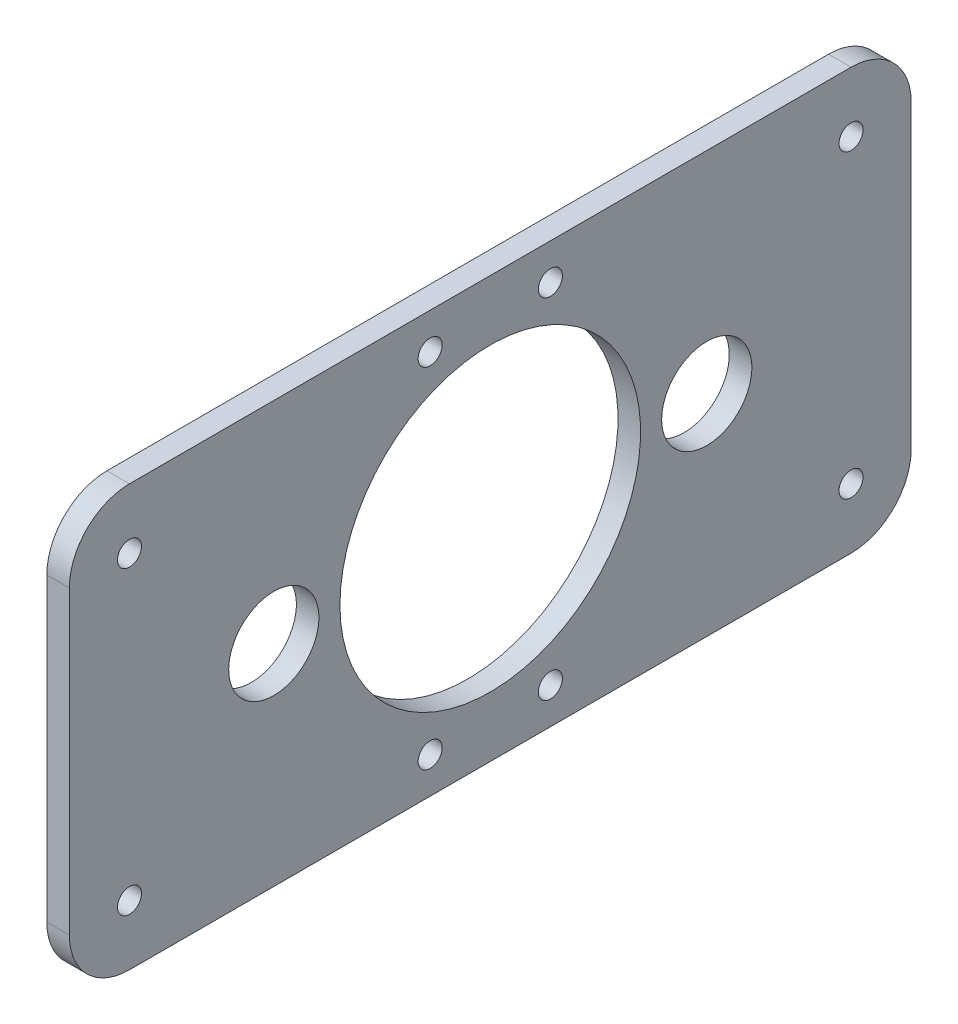
ISO-10303-21;
HEADER;
FILE_DESCRIPTION(('STEP AP214'),'2;1');
FILE_NAME('part.step','',(''),(''),'','','');
FILE_SCHEMA(('AUTOMOTIVE_DESIGN { 1 0 10303 214 1 1 1 1 }'));
ENDSEC;
DATA;
#1=APPLICATION_CONTEXT('core data for automotive mechanical design processes');
#2=APPLICATION_PROTOCOL_DEFINITION('international standard','automotive_design',2000,#1);
#3=PRODUCT_CONTEXT('',#1,'mechanical');
#4=PRODUCT('Part','Part','',(#3));
#5=PRODUCT_RELATED_PRODUCT_CATEGORY('part','',(#4));
#6=PRODUCT_DEFINITION_FORMATION('','',#4);
#7=PRODUCT_DEFINITION_CONTEXT('part definition',#1,'design');
#8=PRODUCT_DEFINITION('design','',#6,#7);
#9=PRODUCT_DEFINITION_SHAPE('','',#8);
#10=(LENGTH_UNIT() NAMED_UNIT(*) SI_UNIT(.MILLI.,.METRE.));
#11=(NAMED_UNIT(*) PLANE_ANGLE_UNIT() SI_UNIT($,.RADIAN.));
#12=(NAMED_UNIT(*) SI_UNIT($,.STERADIAN.) SOLID_ANGLE_UNIT());
#13=UNCERTAINTY_MEASURE_WITH_UNIT(LENGTH_MEASURE(1.E-05),#10,'distance_accuracy_value','');
#14=(GEOMETRIC_REPRESENTATION_CONTEXT(3) GLOBAL_UNCERTAINTY_ASSIGNED_CONTEXT((#13)) GLOBAL_UNIT_ASSIGNED_CONTEXT((#10,
#11,#12)) REPRESENTATION_CONTEXT('',''));
#15=CARTESIAN_POINT('',(0.,0.,0.));
#16=DIRECTION('',(0.,0.,1.));
#17=DIRECTION('',(1.,0.,0.));
#18=AXIS2_PLACEMENT_3D('',#15,#16,#17);
#19=CARTESIAN_POINT('',(4.7625,43.2742885665238,239.434866781271));
#20=DIRECTION('',(1.,0.,0.));
#21=DIRECTION('',(0.,0.,1.));
#22=AXIS2_PLACEMENT_3D('',#19,#20,#21);
#23=CYLINDRICAL_SURFACE('',#22,12.7);
#24=DIRECTION('',(1.,0.,0.));
#25=VECTOR('',#24,1.);
#26=CARTESIAN_POINT('',(4.7625,43.2742885665239,226.734866781271));
#27=LINE('',#26,#25);
#28=CARTESIAN_POINT('',(0.,43.2742885665239,226.734866781271));
#29=VERTEX_POINT('',#28);
#30=CARTESIAN_POINT('',(4.7625,43.2742885665239,226.734866781271));
#31=VERTEX_POINT('',#30);
#32=EDGE_CURVE('E11',#29,#31,#27,.T.);
#33=ORIENTED_EDGE('',*,*,#32,.T.);
#34=CARTESIAN_POINT('',(4.7625,43.2742885665238,239.434866781271));
#35=DIRECTION('',(-1.,0.,0.));
#36=DIRECTION('',(0.,0.,1.));
#37=AXIS2_PLACEMENT_3D('',#34,#35,#36);
#38=CIRCLE('',#37,12.7);
#39=CARTESIAN_POINT('',(4.7625,30.5742885665238,239.434866781271));
#40=VERTEX_POINT('',#39);
#41=EDGE_CURVE('E192',#31,#40,#38,.T.);
#42=ORIENTED_EDGE('',*,*,#41,.T.);
#43=DIRECTION('',(1.,0.,0.));
#44=VECTOR('',#43,1.);
#45=CARTESIAN_POINT('',(4.7625,30.5742885665238,239.434866781271));
#46=LINE('',#45,#44);
#47=CARTESIAN_POINT('',(0.,30.5742885665238,239.434866781271));
#48=VERTEX_POINT('',#47);
#49=EDGE_CURVE('E47',#48,#40,#46,.T.);
#50=ORIENTED_EDGE('',*,*,#49,.F.);
#51=CARTESIAN_POINT('',(0.,43.2742885665238,239.434866781271));
#52=DIRECTION('',(-1.,0.,0.));
#53=DIRECTION('',(0.,0.,1.));
#54=AXIS2_PLACEMENT_3D('',#51,#52,#53);
#55=CIRCLE('',#54,12.7);
#56=EDGE_CURVE('E93',#29,#48,#55,.T.);
#57=ORIENTED_EDGE('',*,*,#56,.F.);
#58=EDGE_LOOP('',(#33,#42,#50,#57));
#59=FACE_BOUND('',#58,.T.);
#60=ADVANCED_FACE('F37',(#59),#23,.T.);
#61=CARTESIAN_POINT('',(4.7625,30.5742885665238,391.834866781271));
#62=DIRECTION('',(0.,-1.,0.));
#63=DIRECTION('',(0.,0.,1.));
#64=AXIS2_PLACEMENT_3D('',#61,#62,#63);
#65=PLANE('',#64);
#66=ORIENTED_EDGE('',*,*,#49,.T.);
#67=DIRECTION('',(0.,0.,1.));
#68=VECTOR('',#67,1.);
#69=CARTESIAN_POINT('',(4.7625,30.5742885665238,391.834866781271));
#70=LINE('',#69,#68);
#71=CARTESIAN_POINT('',(4.7625,30.5742885665238,391.834866781271));
#72=VERTEX_POINT('',#71);
#73=EDGE_CURVE('E187',#40,#72,#70,.T.);
#74=ORIENTED_EDGE('',*,*,#73,.T.);
#75=DIRECTION('',(1.,0.,0.));
#76=VECTOR('',#75,1.);
#77=CARTESIAN_POINT('',(4.7625,30.5742885665238,391.834866781271));
#78=LINE('',#77,#76);
#79=CARTESIAN_POINT('',(0.,30.5742885665238,391.834866781271));
#80=VERTEX_POINT('',#79);
#81=EDGE_CURVE('E174',#80,#72,#78,.T.);
#82=ORIENTED_EDGE('',*,*,#81,.F.);
#83=DIRECTION('',(0.,0.,1.));
#84=VECTOR('',#83,1.);
#85=CARTESIAN_POINT('',(0.,30.5742885665238,239.434866781271));
#86=LINE('',#85,#84);
#87=EDGE_CURVE('E144',#48,#80,#86,.T.);
#88=ORIENTED_EDGE('',*,*,#87,.F.);
#89=EDGE_LOOP('',(#66,#74,#82,#88));
#90=FACE_BOUND('',#89,.T.);
#91=ADVANCED_FACE('F183',(#90),#65,.T.);
#92=CARTESIAN_POINT('',(4.7625,43.2742885665238,391.834866781271));
#93=DIRECTION('',(1.,0.,0.));
#94=DIRECTION('',(0.,0.,1.));
#95=AXIS2_PLACEMENT_3D('',#92,#93,#94);
#96=CYLINDRICAL_SURFACE('',#95,12.7);
#97=ORIENTED_EDGE('',*,*,#81,.T.);
#98=CARTESIAN_POINT('',(4.7625,43.2742885665238,391.834866781271));
#99=DIRECTION('',(-1.,0.,0.));
#100=DIRECTION('',(0.,0.,1.));
#101=AXIS2_PLACEMENT_3D('',#98,#99,#100);
#102=CIRCLE('',#101,12.7);
#103=CARTESIAN_POINT('',(4.7625,43.2742885665239,404.534866781271));
#104=VERTEX_POINT('',#103);
#105=EDGE_CURVE('E195',#72,#104,#102,.T.);
#106=ORIENTED_EDGE('',*,*,#105,.T.);
#107=DIRECTION('',(1.,0.,0.));
#108=VECTOR('',#107,1.);
#109=CARTESIAN_POINT('',(4.7625,43.2742885665239,404.534866781271));
#110=LINE('',#109,#108);
#111=CARTESIAN_POINT('',(0.,43.2742885665239,404.534866781271));
#112=VERTEX_POINT('',#111);
#113=EDGE_CURVE('E171',#112,#104,#110,.T.);
#114=ORIENTED_EDGE('',*,*,#113,.F.);
#115=CARTESIAN_POINT('',(0.,43.2742885665238,391.834866781271));
#116=DIRECTION('',(-1.,0.,0.));
#117=DIRECTION('',(0.,0.,1.));
#118=AXIS2_PLACEMENT_3D('',#115,#116,#117);
#119=CIRCLE('',#118,12.7);
#120=EDGE_CURVE('E141',#80,#112,#119,.T.);
#121=ORIENTED_EDGE('',*,*,#120,.F.);
#122=EDGE_LOOP('',(#97,#106,#114,#121));
#123=FACE_BOUND('',#122,.T.);
#124=ADVANCED_FACE('F255',(#123),#96,.T.);
#125=CARTESIAN_POINT('',(4.7625,43.2742885665239,404.534866781271));
#126=DIRECTION('',(0.,0.,1.));
#127=DIRECTION('',(0.,1.,0.));
#128=AXIS2_PLACEMENT_3D('',#125,#126,#127);
#129=PLANE('',#128);
#130=ORIENTED_EDGE('',*,*,#113,.T.);
#131=DIRECTION('',(0.,1.,0.));
#132=VECTOR('',#131,1.);
#133=CARTESIAN_POINT('',(4.7625,43.2742885665239,404.534866781271));
#134=LINE('',#133,#132);
#135=CARTESIAN_POINT('',(4.7625,106.774288566524,404.534866781271));
#136=VERTEX_POINT('',#135);
#137=EDGE_CURVE('E202',#104,#136,#134,.T.);
#138=ORIENTED_EDGE('',*,*,#137,.T.);
#139=DIRECTION('',(1.,0.,0.));
#140=VECTOR('',#139,1.);
#141=CARTESIAN_POINT('',(4.7625,106.774288566524,404.534866781271));
#142=LINE('',#141,#140);
#143=CARTESIAN_POINT('',(0.,106.774288566524,404.534866781271));
#144=VERTEX_POINT('',#143);
#145=EDGE_CURVE('E168',#144,#136,#142,.T.);
#146=ORIENTED_EDGE('',*,*,#145,.F.);
#147=DIRECTION('',(0.,1.,0.));
#148=VECTOR('',#147,1.);
#149=CARTESIAN_POINT('',(0.,106.774288566524,404.534866781271));
#150=LINE('',#149,#148);
#151=EDGE_CURVE('E138',#112,#144,#150,.T.);
#152=ORIENTED_EDGE('',*,*,#151,.F.);
#153=EDGE_LOOP('',(#130,#138,#146,#152));
#154=FACE_BOUND('',#153,.T.);
#155=ADVANCED_FACE('F349',(#154),#129,.T.);
#156=CARTESIAN_POINT('',(4.7625,106.774288566524,391.834866781271));
#157=DIRECTION('',(1.,0.,0.));
#158=DIRECTION('',(0.,0.,1.));
#159=AXIS2_PLACEMENT_3D('',#156,#157,#158);
#160=CYLINDRICAL_SURFACE('',#159,12.7);
#161=ORIENTED_EDGE('',*,*,#145,.T.);
#162=CARTESIAN_POINT('',(4.7625,106.774288566524,391.834866781271));
#163=DIRECTION('',(-1.,0.,0.));
#164=DIRECTION('',(0.,0.,1.));
#165=AXIS2_PLACEMENT_3D('',#162,#163,#164);
#166=CIRCLE('',#165,12.7);
#167=CARTESIAN_POINT('',(4.7625,119.474288566524,391.834866781271));
#168=VERTEX_POINT('',#167);
#169=EDGE_CURVE('E205',#136,#168,#166,.T.);
#170=ORIENTED_EDGE('',*,*,#169,.T.);
#171=DIRECTION('',(1.,0.,0.));
#172=VECTOR('',#171,1.);
#173=CARTESIAN_POINT('',(4.7625,119.474288566524,391.834866781271));
#174=LINE('',#173,#172);
#175=CARTESIAN_POINT('',(0.,119.474288566524,391.834866781271));
#176=VERTEX_POINT('',#175);
#177=EDGE_CURVE('E108',#176,#168,#174,.T.);
#178=ORIENTED_EDGE('',*,*,#177,.F.);
#179=CARTESIAN_POINT('',(0.,106.774288566524,391.834866781271));
#180=DIRECTION('',(-1.,0.,0.));
#181=DIRECTION('',(0.,0.,1.));
#182=AXIS2_PLACEMENT_3D('',#179,#180,#181);
#183=CIRCLE('',#182,12.7);
#184=EDGE_CURVE('E136',#144,#176,#183,.T.);
#185=ORIENTED_EDGE('',*,*,#184,.F.);
#186=EDGE_LOOP('',(#161,#170,#178,#185));
#187=FACE_BOUND('',#186,.T.);
#188=ADVANCED_FACE('F361',(#187),#160,.T.);
#189=CARTESIAN_POINT('',(4.7625,119.474288566524,391.834866781271));
#190=DIRECTION('',(0.,1.,0.));
#191=DIRECTION('',(0.,0.,-1.));
#192=AXIS2_PLACEMENT_3D('',#189,#190,#191);
#193=PLANE('',#192);
#194=ORIENTED_EDGE('',*,*,#177,.T.);
#195=DIRECTION('',(0.,0.,-1.));
#196=VECTOR('',#195,1.);
#197=CARTESIAN_POINT('',(4.7625,119.474288566524,391.834866781271));
#198=LINE('',#197,#196);
#199=CARTESIAN_POINT('',(4.7625,119.474288566524,239.434866781271));
#200=VERTEX_POINT('',#199);
#201=EDGE_CURVE('E208',#168,#200,#198,.T.);
#202=ORIENTED_EDGE('',*,*,#201,.T.);
#203=DIRECTION('',(1.,0.,0.));
#204=VECTOR('',#203,1.);
#205=CARTESIAN_POINT('',(4.7625,119.474288566524,239.434866781271));
#206=LINE('',#205,#204);
#207=CARTESIAN_POINT('',(0.,119.474288566524,239.434866781271));
#208=VERTEX_POINT('',#207);
#209=EDGE_CURVE('E106',#208,#200,#206,.T.);
#210=ORIENTED_EDGE('',*,*,#209,.F.);
#211=DIRECTION('',(0.,0.,1.));
#212=VECTOR('',#211,1.);
#213=CARTESIAN_POINT('',(0.,119.474288566524,239.434866781271));
#214=LINE('',#213,#212);
#215=EDGE_CURVE('E100',#176,#208,#214,.F.);
#216=ORIENTED_EDGE('',*,*,#215,.F.);
#217=EDGE_LOOP('',(#194,#202,#210,#216));
#218=FACE_BOUND('',#217,.T.);
#219=ADVANCED_FACE('F374',(#218),#193,.T.);
#220=CARTESIAN_POINT('',(4.7625,106.774288566524,239.434866781271));
#221=DIRECTION('',(1.,0.,0.));
#222=DIRECTION('',(0.,0.,1.));
#223=AXIS2_PLACEMENT_3D('',#220,#221,#222);
#224=CYLINDRICAL_SURFACE('',#223,12.7);
#225=ORIENTED_EDGE('',*,*,#209,.T.);
#226=CARTESIAN_POINT('',(4.7625,106.774288566524,239.434866781271));
#227=DIRECTION('',(-1.,0.,0.));
#228=DIRECTION('',(0.,0.,1.));
#229=AXIS2_PLACEMENT_3D('',#226,#227,#228);
#230=CIRCLE('',#229,12.7);
#231=CARTESIAN_POINT('',(4.7625,106.774288566524,226.734866781271));
#232=VERTEX_POINT('',#231);
#233=EDGE_CURVE('E55',#200,#232,#230,.T.);
#234=ORIENTED_EDGE('',*,*,#233,.T.);
#235=DIRECTION('',(1.,0.,0.));
#236=VECTOR('',#235,1.);
#237=CARTESIAN_POINT('',(4.7625,106.774288566524,226.734866781271));
#238=LINE('',#237,#236);
#239=CARTESIAN_POINT('',(0.,106.774288566524,226.734866781271));
#240=VERTEX_POINT('',#239);
#241=EDGE_CURVE('E41',#240,#232,#238,.T.);
#242=ORIENTED_EDGE('',*,*,#241,.F.);
#243=CARTESIAN_POINT('',(0.,106.774288566524,239.434866781271));
#244=DIRECTION('',(-1.,0.,0.));
#245=DIRECTION('',(0.,0.,1.));
#246=AXIS2_PLACEMENT_3D('',#243,#244,#245);
#247=CIRCLE('',#246,12.7);
#248=EDGE_CURVE('E94',#208,#240,#247,.T.);
#249=ORIENTED_EDGE('',*,*,#248,.F.);
#250=EDGE_LOOP('',(#225,#234,#242,#249));
#251=FACE_BOUND('',#250,.T.);
#252=ADVANCED_FACE('F105',(#251),#224,.T.);
#253=CARTESIAN_POINT('',(4.7625,75.0242885665238,269.914866781271));
#254=DIRECTION('',(1.,0.,0.));
#255=DIRECTION('',(0.,0.,1.));
#256=AXIS2_PLACEMENT_3D('',#253,#254,#255);
#257=CYLINDRICAL_SURFACE('',#256,9.52500000000002);
#258=CARTESIAN_POINT('',(4.7625,75.0242885665238,269.914866781271));
#259=DIRECTION('',(-1.,0.,0.));
#260=DIRECTION('',(0.,0.,1.));
#261=AXIS2_PLACEMENT_3D('',#258,#259,#260);
#262=CIRCLE('',#261,9.52500000000002);
#263=CARTESIAN_POINT('',(4.7625,75.0242885665238,279.439866781271));
#264=VERTEX_POINT('',#263);
#265=EDGE_CURVE('E164',#264,#264,#262,.T.);
#266=ORIENTED_EDGE('',*,*,#265,.F.);
#267=EDGE_LOOP('',(#266));
#268=FACE_BOUND('',#267,.T.);
#269=CARTESIAN_POINT('',(0.,75.0242885665238,269.914866781271));
#270=DIRECTION('',(-1.,0.,0.));
#271=DIRECTION('',(0.,0.,1.));
#272=AXIS2_PLACEMENT_3D('',#269,#270,#271);
#273=CIRCLE('',#272,9.52500000000002);
#274=CARTESIAN_POINT('',(0.,75.0242885665238,279.439866781271));
#275=VERTEX_POINT('',#274);
#276=EDGE_CURVE('E120',#275,#275,#273,.T.);
#277=ORIENTED_EDGE('',*,*,#276,.T.);
#278=EDGE_LOOP('',(#277));
#279=FACE_BOUND('',#278,.T.);
#280=ADVANCED_FACE('F318',(#268,#279),#257,.F.);
#281=CARTESIAN_POINT('',(4.7625,106.774288566524,239.434866781271));
#282=DIRECTION('',(1.,0.,0.));
#283=DIRECTION('',(0.,0.,1.));
#284=AXIS2_PLACEMENT_3D('',#281,#282,#283);
#285=CYLINDRICAL_SURFACE('',#284,2.53999999999998);
#286=CARTESIAN_POINT('',(4.7625,106.774288566524,239.434866781271));
#287=DIRECTION('',(-1.,0.,0.));
#288=DIRECTION('',(0.,0.,1.));
#289=AXIS2_PLACEMENT_3D('',#286,#287,#288);
#290=CIRCLE('',#289,2.53999999999998);
#291=CARTESIAN_POINT('',(4.7625,106.774288566524,241.974866781271));
#292=VERTEX_POINT('',#291);
#293=EDGE_CURVE('E548',#292,#292,#290,.T.);
#294=ORIENTED_EDGE('',*,*,#293,.F.);
#295=EDGE_LOOP('',(#294));
#296=FACE_BOUND('',#295,.T.);
#297=CARTESIAN_POINT('',(0.,106.774288566524,239.434866781271));
#298=DIRECTION('',(-1.,0.,0.));
#299=DIRECTION('',(0.,0.,1.));
#300=AXIS2_PLACEMENT_3D('',#297,#298,#299);
#301=CIRCLE('',#300,2.53999999999998);
#302=CARTESIAN_POINT('',(0.,106.774288566524,241.974866781271));
#303=VERTEX_POINT('',#302);
#304=EDGE_CURVE('E123',#303,#303,#301,.T.);
#305=ORIENTED_EDGE('',*,*,#304,.T.);
#306=EDGE_LOOP('',(#305));
#307=FACE_BOUND('',#306,.T.);
#308=ADVANCED_FACE('F323',(#296,#307),#285,.F.);
#309=CARTESIAN_POINT('',(4.7625,43.2742885665238,391.834866781271));
#310=DIRECTION('',(1.,0.,0.));
#311=DIRECTION('',(0.,0.,1.));
#312=AXIS2_PLACEMENT_3D('',#309,#310,#311);
#313=CYLINDRICAL_SURFACE('',#312,2.53999999999995);
#314=CARTESIAN_POINT('',(4.7625,43.2742885665238,391.834866781271));
#315=DIRECTION('',(-1.,0.,0.));
#316=DIRECTION('',(0.,0.,1.));
#317=AXIS2_PLACEMENT_3D('',#314,#315,#316);
#318=CIRCLE('',#317,2.53999999999995);
#319=CARTESIAN_POINT('',(4.7625,43.2742885665238,394.374866781271));
#320=VERTEX_POINT('',#319);
#321=EDGE_CURVE('E543',#320,#320,#318,.T.);
#322=ORIENTED_EDGE('',*,*,#321,.F.);
#323=EDGE_LOOP('',(#322));
#324=FACE_BOUND('',#323,.T.);
#325=CARTESIAN_POINT('',(0.,43.2742885665238,391.834866781271));
#326=DIRECTION('',(-1.,0.,0.));
#327=DIRECTION('',(0.,0.,1.));
#328=AXIS2_PLACEMENT_3D('',#325,#326,#327);
#329=CIRCLE('',#328,2.53999999999995);
#330=CARTESIAN_POINT('',(0.,43.2742885665238,394.374866781271));
#331=VERTEX_POINT('',#330);
#332=EDGE_CURVE('E126',#331,#331,#329,.T.);
#333=ORIENTED_EDGE('',*,*,#332,.T.);
#334=EDGE_LOOP('',(#333));
#335=FACE_BOUND('',#334,.T.);
#336=ADVANCED_FACE('F336',(#324,#335),#313,.F.);
#337=CARTESIAN_POINT('',(4.7625,38.1942885665238,328.334866781271));
#338=DIRECTION('',(1.,0.,0.));
#339=DIRECTION('',(0.,0.,1.));
#340=AXIS2_PLACEMENT_3D('',#337,#338,#339);
#341=CYLINDRICAL_SURFACE('',#340,2.54000000000001);
#342=CARTESIAN_POINT('',(4.7625,38.1942885665238,328.334866781271));
#343=DIRECTION('',(-1.,0.,0.));
#344=DIRECTION('',(0.,0.,1.));
#345=AXIS2_PLACEMENT_3D('',#342,#343,#344);
#346=CIRCLE('',#345,2.54000000000001);
#347=CARTESIAN_POINT('',(4.7625,38.1942885665238,330.874866781271));
#348=VERTEX_POINT('',#347);
#349=EDGE_CURVE('E540',#348,#348,#346,.T.);
#350=ORIENTED_EDGE('',*,*,#349,.F.);
#351=EDGE_LOOP('',(#350));
#352=FACE_BOUND('',#351,.T.);
#353=CARTESIAN_POINT('',(0.,38.1942885665238,328.334866781271));
#354=DIRECTION('',(-1.,0.,0.));
#355=DIRECTION('',(0.,0.,1.));
#356=AXIS2_PLACEMENT_3D('',#353,#354,#355);
#357=CIRCLE('',#356,2.54000000000001);
#358=CARTESIAN_POINT('',(0.,38.1942885665238,330.874866781271));
#359=VERTEX_POINT('',#358);
#360=EDGE_CURVE('E129',#359,#359,#357,.T.);
#361=ORIENTED_EDGE('',*,*,#360,.T.);
#362=EDGE_LOOP('',(#361));
#363=FACE_BOUND('',#362,.T.);
#364=ADVANCED_FACE('F416',(#352,#363),#341,.F.);
#365=CARTESIAN_POINT('',(4.7625,111.854288566524,328.334866781271));
#366=DIRECTION('',(1.,0.,0.));
#367=DIRECTION('',(0.,0.,1.));
#368=AXIS2_PLACEMENT_3D('',#365,#366,#367);
#369=CYLINDRICAL_SURFACE('',#368,2.54000000000001);
#370=CARTESIAN_POINT('',(4.7625,111.854288566524,328.334866781271));
#371=DIRECTION('',(-1.,0.,0.));
#372=DIRECTION('',(0.,0.,1.));
#373=AXIS2_PLACEMENT_3D('',#370,#371,#372);
#374=CIRCLE('',#373,2.54000000000001);
#375=CARTESIAN_POINT('',(4.7625,111.854288566524,330.874866781271));
#376=VERTEX_POINT('',#375);
#377=EDGE_CURVE('E536',#376,#376,#374,.T.);
#378=ORIENTED_EDGE('',*,*,#377,.F.);
#379=EDGE_LOOP('',(#378));
#380=FACE_BOUND('',#379,.T.);
#381=CARTESIAN_POINT('',(0.,111.854288566524,328.334866781271));
#382=DIRECTION('',(-1.,0.,0.));
#383=DIRECTION('',(0.,0.,1.));
#384=AXIS2_PLACEMENT_3D('',#381,#382,#383);
#385=CIRCLE('',#384,2.54000000000001);
#386=CARTESIAN_POINT('',(0.,111.854288566524,330.874866781271));
#387=VERTEX_POINT('',#386);
#388=EDGE_CURVE('E103',#387,#387,#385,.T.);
#389=ORIENTED_EDGE('',*,*,#388,.T.);
#390=EDGE_LOOP('',(#389));
#391=FACE_BOUND('',#390,.T.);
#392=ADVANCED_FACE('F262',(#380,#391),#369,.F.);
#393=CARTESIAN_POINT('',(4.7625,43.2742885665239,226.734866781271));
#394=DIRECTION('',(0.,0.,-1.));
#395=DIRECTION('',(0.,-1.,0.));
#396=AXIS2_PLACEMENT_3D('',#393,#394,#395);
#397=PLANE('',#396);
#398=DIRECTION('',(0.,1.,0.));
#399=VECTOR('',#398,1.);
#400=CARTESIAN_POINT('',(0.,106.774288566524,226.734866781271));
#401=LINE('',#400,#399);
#402=EDGE_CURVE('E85',#240,#29,#401,.F.);
#403=ORIENTED_EDGE('',*,*,#402,.F.);
#404=ORIENTED_EDGE('',*,*,#241,.T.);
#405=DIRECTION('',(0.,-1.,0.));
#406=VECTOR('',#405,1.);
#407=CARTESIAN_POINT('',(4.7625,43.2742885665239,226.734866781271));
#408=LINE('',#407,#406);
#409=EDGE_CURVE('E193',#232,#31,#408,.T.);
#410=ORIENTED_EDGE('',*,*,#409,.T.);
#411=ORIENTED_EDGE('',*,*,#32,.F.);
#412=EDGE_LOOP('',(#403,#404,#410,#411));
#413=FACE_BOUND('',#412,.T.);
#414=ADVANCED_FACE('F90',(#413),#397,.T.);
#415=CARTESIAN_POINT('',(4.7625,111.854288566524,302.934866781271));
#416=DIRECTION('',(1.,0.,0.));
#417=DIRECTION('',(0.,0.,1.));
#418=AXIS2_PLACEMENT_3D('',#415,#416,#417);
#419=CYLINDRICAL_SURFACE('',#418,2.54000000000001);
#420=CARTESIAN_POINT('',(4.7625,111.854288566524,302.934866781271));
#421=DIRECTION('',(-1.,0.,0.));
#422=DIRECTION('',(0.,0.,1.));
#423=AXIS2_PLACEMENT_3D('',#420,#421,#422);
#424=CIRCLE('',#423,2.54000000000001);
#425=CARTESIAN_POINT('',(4.7625,111.854288566524,305.474866781271));
#426=VERTEX_POINT('',#425);
#427=EDGE_CURVE('E211',#426,#426,#424,.T.);
#428=ORIENTED_EDGE('',*,*,#427,.F.);
#429=EDGE_LOOP('',(#428));
#430=FACE_BOUND('',#429,.T.);
#431=CARTESIAN_POINT('',(0.,111.854288566524,302.934866781271));
#432=DIRECTION('',(-1.,0.,0.));
#433=DIRECTION('',(0.,0.,1.));
#434=AXIS2_PLACEMENT_3D('',#431,#432,#433);
#435=CIRCLE('',#434,2.54000000000001);
#436=CARTESIAN_POINT('',(0.,111.854288566524,305.474866781271));
#437=VERTEX_POINT('',#436);
#438=EDGE_CURVE('E135',#437,#437,#435,.T.);
#439=ORIENTED_EDGE('',*,*,#438,.T.);
#440=EDGE_LOOP('',(#439));
#441=FACE_BOUND('',#440,.T.);
#442=ADVANCED_FACE('F261',(#430,#441),#419,.F.);
#443=CARTESIAN_POINT('',(4.7625,38.1942885665238,302.934866781271));
#444=DIRECTION('',(1.,0.,0.));
#445=DIRECTION('',(0.,0.,1.));
#446=AXIS2_PLACEMENT_3D('',#443,#444,#445);
#447=CYLINDRICAL_SURFACE('',#446,2.54000000000001);
#448=CARTESIAN_POINT('',(4.7625,38.1942885665238,302.934866781271));
#449=DIRECTION('',(-1.,0.,0.));
#450=DIRECTION('',(0.,0.,1.));
#451=AXIS2_PLACEMENT_3D('',#448,#449,#450);
#452=CIRCLE('',#451,2.54000000000001);
#453=CARTESIAN_POINT('',(4.7625,38.1942885665238,305.474866781271));
#454=VERTEX_POINT('',#453);
#455=EDGE_CURVE('E214',#454,#454,#452,.T.);
#456=ORIENTED_EDGE('',*,*,#455,.F.);
#457=EDGE_LOOP('',(#456));
#458=FACE_BOUND('',#457,.T.);
#459=CARTESIAN_POINT('',(0.,38.1942885665238,302.934866781271));
#460=DIRECTION('',(-1.,0.,0.));
#461=DIRECTION('',(0.,0.,1.));
#462=AXIS2_PLACEMENT_3D('',#459,#460,#461);
#463=CIRCLE('',#462,2.54000000000001);
#464=CARTESIAN_POINT('',(0.,38.1942885665238,305.474866781271));
#465=VERTEX_POINT('',#464);
#466=EDGE_CURVE('E150',#465,#465,#463,.T.);
#467=ORIENTED_EDGE('',*,*,#466,.T.);
#468=EDGE_LOOP('',(#467));
#469=FACE_BOUND('',#468,.T.);
#470=ADVANCED_FACE('F265',(#458,#469),#447,.F.);
#471=CARTESIAN_POINT('',(4.7625,43.2742885665238,239.434866781271));
#472=DIRECTION('',(1.,0.,0.));
#473=DIRECTION('',(0.,0.,1.));
#474=AXIS2_PLACEMENT_3D('',#471,#472,#473);
#475=CYLINDRICAL_SURFACE('',#474,2.53999999999998);
#476=CARTESIAN_POINT('',(4.7625,43.2742885665238,239.434866781271));
#477=DIRECTION('',(-1.,0.,0.));
#478=DIRECTION('',(0.,0.,1.));
#479=AXIS2_PLACEMENT_3D('',#476,#477,#478);
#480=CIRCLE('',#479,2.53999999999998);
#481=CARTESIAN_POINT('',(4.7625,43.2742885665238,241.974866781271));
#482=VERTEX_POINT('',#481);
#483=EDGE_CURVE('E217',#482,#482,#480,.T.);
#484=ORIENTED_EDGE('',*,*,#483,.F.);
#485=EDGE_LOOP('',(#484));
#486=FACE_BOUND('',#485,.T.);
#487=CARTESIAN_POINT('',(0.,43.2742885665238,239.434866781271));
#488=DIRECTION('',(-1.,0.,0.));
#489=DIRECTION('',(0.,0.,1.));
#490=AXIS2_PLACEMENT_3D('',#487,#488,#489);
#491=CIRCLE('',#490,2.53999999999998);
#492=CARTESIAN_POINT('',(0.,43.2742885665238,241.974866781271));
#493=VERTEX_POINT('',#492);
#494=EDGE_CURVE('E153',#493,#493,#491,.T.);
#495=ORIENTED_EDGE('',*,*,#494,.T.);
#496=EDGE_LOOP('',(#495));
#497=FACE_BOUND('',#496,.T.);
#498=ADVANCED_FACE('F229',(#486,#497),#475,.F.);
#499=CARTESIAN_POINT('',(4.7625,75.0242885665238,315.634866781271));
#500=DIRECTION('',(1.,0.,0.));
#501=DIRECTION('',(0.,0.,1.));
#502=AXIS2_PLACEMENT_3D('',#499,#500,#501);
#503=CYLINDRICAL_SURFACE('',#502,31.75);
#504=CARTESIAN_POINT('',(4.7625,75.0242885665238,315.634866781271));
#505=DIRECTION('',(-1.,0.,0.));
#506=DIRECTION('',(0.,0.,1.));
#507=AXIS2_PLACEMENT_3D('',#504,#505,#506);
#508=CIRCLE('',#507,31.75);
#509=CARTESIAN_POINT('',(4.7625,75.0242885665238,347.384866781271));
#510=VERTEX_POINT('',#509);
#511=EDGE_CURVE('E116',#510,#510,#508,.T.);
#512=ORIENTED_EDGE('',*,*,#511,.F.);
#513=EDGE_LOOP('',(#512));
#514=FACE_BOUND('',#513,.T.);
#515=CARTESIAN_POINT('',(0.,75.0242885665238,315.634866781271));
#516=DIRECTION('',(-1.,0.,0.));
#517=DIRECTION('',(0.,0.,1.));
#518=AXIS2_PLACEMENT_3D('',#515,#516,#517);
#519=CIRCLE('',#518,31.75);
#520=CARTESIAN_POINT('',(0.,75.0242885665238,347.384866781271));
#521=VERTEX_POINT('',#520);
#522=EDGE_CURVE('E156',#521,#521,#519,.T.);
#523=ORIENTED_EDGE('',*,*,#522,.T.);
#524=EDGE_LOOP('',(#523));
#525=FACE_BOUND('',#524,.T.);
#526=ADVANCED_FACE('F225',(#514,#525),#503,.F.);
#527=CARTESIAN_POINT('',(4.7625,106.774288566524,391.834866781271));
#528=DIRECTION('',(1.,0.,0.));
#529=DIRECTION('',(0.,0.,1.));
#530=AXIS2_PLACEMENT_3D('',#527,#528,#529);
#531=CYLINDRICAL_SURFACE('',#530,2.53999999999995);
#532=CARTESIAN_POINT('',(4.7625,106.774288566524,391.834866781271));
#533=DIRECTION('',(-1.,0.,0.));
#534=DIRECTION('',(0.,0.,1.));
#535=AXIS2_PLACEMENT_3D('',#532,#533,#534);
#536=CIRCLE('',#535,2.53999999999995);
#537=CARTESIAN_POINT('',(4.7625,106.774288566524,394.374866781271));
#538=VERTEX_POINT('',#537);
#539=EDGE_CURVE('E111',#538,#538,#536,.T.);
#540=ORIENTED_EDGE('',*,*,#539,.F.);
#541=EDGE_LOOP('',(#540));
#542=FACE_BOUND('',#541,.T.);
#543=CARTESIAN_POINT('',(0.,106.774288566524,391.834866781271));
#544=DIRECTION('',(-1.,0.,0.));
#545=DIRECTION('',(0.,0.,1.));
#546=AXIS2_PLACEMENT_3D('',#543,#544,#545);
#547=CIRCLE('',#546,2.53999999999995);
#548=CARTESIAN_POINT('',(0.,106.774288566524,394.374866781271));
#549=VERTEX_POINT('',#548);
#550=EDGE_CURVE('E159',#549,#549,#547,.T.);
#551=ORIENTED_EDGE('',*,*,#550,.T.);
#552=EDGE_LOOP('',(#551));
#553=FACE_BOUND('',#552,.T.);
#554=ADVANCED_FACE('F228',(#542,#553),#531,.F.);
#555=CARTESIAN_POINT('',(4.7625,75.0242885665238,361.354866781271));
#556=DIRECTION('',(1.,0.,0.));
#557=DIRECTION('',(0.,0.,1.));
#558=AXIS2_PLACEMENT_3D('',#555,#556,#557);
#559=CYLINDRICAL_SURFACE('',#558,9.52500000000002);
#560=CARTESIAN_POINT('',(4.7625,75.0242885665238,361.354866781271));
#561=DIRECTION('',(-1.,0.,0.));
#562=DIRECTION('',(0.,0.,1.));
#563=AXIS2_PLACEMENT_3D('',#560,#561,#562);
#564=CIRCLE('',#563,9.52500000000002);
#565=CARTESIAN_POINT('',(4.7625,75.0242885665238,370.879866781271));
#566=VERTEX_POINT('',#565);
#567=EDGE_CURVE('E107',#566,#566,#564,.T.);
#568=ORIENTED_EDGE('',*,*,#567,.F.);
#569=EDGE_LOOP('',(#568));
#570=FACE_BOUND('',#569,.T.);
#571=CARTESIAN_POINT('',(0.,75.0242885665238,361.354866781271));
#572=DIRECTION('',(-1.,0.,0.));
#573=DIRECTION('',(0.,0.,1.));
#574=AXIS2_PLACEMENT_3D('',#571,#572,#573);
#575=CIRCLE('',#574,9.52500000000002);
#576=CARTESIAN_POINT('',(0.,75.0242885665238,370.879866781271));
#577=VERTEX_POINT('',#576);
#578=EDGE_CURVE('E162',#577,#577,#575,.T.);
#579=ORIENTED_EDGE('',*,*,#578,.T.);
#580=EDGE_LOOP('',(#579));
#581=FACE_BOUND('',#580,.T.);
#582=ADVANCED_FACE('F39',(#570,#581),#559,.F.);
#583=CARTESIAN_POINT('',(4.7625,106.774288566524,239.434866781271));
#584=DIRECTION('',(1.,0.,0.));
#585=DIRECTION('',(0.,0.,1.));
#586=AXIS2_PLACEMENT_3D('',#583,#584,#585);
#587=PLANE('',#586);
#588=ORIENTED_EDGE('',*,*,#265,.T.);
#589=EDGE_LOOP('',(#588));
#590=FACE_BOUND('',#589,.T.);
#591=ORIENTED_EDGE('',*,*,#293,.T.);
#592=EDGE_LOOP('',(#591));
#593=FACE_BOUND('',#592,.T.);
#594=ORIENTED_EDGE('',*,*,#321,.T.);
#595=EDGE_LOOP('',(#594));
#596=FACE_BOUND('',#595,.T.);
#597=ORIENTED_EDGE('',*,*,#349,.T.);
#598=EDGE_LOOP('',(#597));
#599=FACE_BOUND('',#598,.T.);
#600=ORIENTED_EDGE('',*,*,#377,.T.);
#601=EDGE_LOOP('',(#600));
#602=FACE_BOUND('',#601,.T.);
#603=ORIENTED_EDGE('',*,*,#233,.F.);
#604=ORIENTED_EDGE('',*,*,#201,.F.);
#605=ORIENTED_EDGE('',*,*,#169,.F.);
#606=ORIENTED_EDGE('',*,*,#137,.F.);
#607=ORIENTED_EDGE('',*,*,#105,.F.);
#608=ORIENTED_EDGE('',*,*,#73,.F.);
#609=ORIENTED_EDGE('',*,*,#41,.F.);
#610=ORIENTED_EDGE('',*,*,#409,.F.);
#611=EDGE_LOOP('',(#603,#604,#605,#606,#607,#608,#609,#610));
#612=FACE_BOUND('',#611,.T.);
#613=ORIENTED_EDGE('',*,*,#427,.T.);
#614=EDGE_LOOP('',(#613));
#615=FACE_BOUND('',#614,.T.);
#616=ORIENTED_EDGE('',*,*,#455,.T.);
#617=EDGE_LOOP('',(#616));
#618=FACE_BOUND('',#617,.T.);
#619=ORIENTED_EDGE('',*,*,#483,.T.);
#620=EDGE_LOOP('',(#619));
#621=FACE_BOUND('',#620,.T.);
#622=ORIENTED_EDGE('',*,*,#511,.T.);
#623=EDGE_LOOP('',(#622));
#624=FACE_BOUND('',#623,.T.);
#625=ORIENTED_EDGE('',*,*,#539,.T.);
#626=EDGE_LOOP('',(#625));
#627=FACE_BOUND('',#626,.T.);
#628=ORIENTED_EDGE('',*,*,#567,.T.);
#629=EDGE_LOOP('',(#628));
#630=FACE_BOUND('',#629,.T.);
#631=ADVANCED_FACE('F222',(#590,#593,#596,#599,#602,#612,#615,#618,#621,#624,#627,#630),#587,.T.);
#632=CARTESIAN_POINT('',(0.,106.774288566524,239.434866781271));
#633=DIRECTION('',(1.,0.,0.));
#634=DIRECTION('',(0.,0.,1.));
#635=AXIS2_PLACEMENT_3D('',#632,#633,#634);
#636=PLANE('',#635);
#637=ORIENTED_EDGE('',*,*,#276,.F.);
#638=EDGE_LOOP('',(#637));
#639=FACE_BOUND('',#638,.T.);
#640=ORIENTED_EDGE('',*,*,#304,.F.);
#641=EDGE_LOOP('',(#640));
#642=FACE_BOUND('',#641,.T.);
#643=ORIENTED_EDGE('',*,*,#332,.F.);
#644=EDGE_LOOP('',(#643));
#645=FACE_BOUND('',#644,.T.);
#646=ORIENTED_EDGE('',*,*,#360,.F.);
#647=EDGE_LOOP('',(#646));
#648=FACE_BOUND('',#647,.T.);
#649=ORIENTED_EDGE('',*,*,#388,.F.);
#650=EDGE_LOOP('',(#649));
#651=FACE_BOUND('',#650,.T.);
#652=ORIENTED_EDGE('',*,*,#248,.T.);
#653=ORIENTED_EDGE('',*,*,#402,.T.);
#654=ORIENTED_EDGE('',*,*,#56,.T.);
#655=ORIENTED_EDGE('',*,*,#87,.T.);
#656=ORIENTED_EDGE('',*,*,#120,.T.);
#657=ORIENTED_EDGE('',*,*,#151,.T.);
#658=ORIENTED_EDGE('',*,*,#184,.T.);
#659=ORIENTED_EDGE('',*,*,#215,.T.);
#660=EDGE_LOOP('',(#652,#653,#654,#655,#656,#657,#658,#659));
#661=FACE_BOUND('',#660,.T.);
#662=ORIENTED_EDGE('',*,*,#438,.F.);
#663=EDGE_LOOP('',(#662));
#664=FACE_BOUND('',#663,.T.);
#665=ORIENTED_EDGE('',*,*,#466,.F.);
#666=EDGE_LOOP('',(#665));
#667=FACE_BOUND('',#666,.T.);
#668=ORIENTED_EDGE('',*,*,#494,.F.);
#669=EDGE_LOOP('',(#668));
#670=FACE_BOUND('',#669,.T.);
#671=ORIENTED_EDGE('',*,*,#522,.F.);
#672=EDGE_LOOP('',(#671));
#673=FACE_BOUND('',#672,.T.);
#674=ORIENTED_EDGE('',*,*,#550,.F.);
#675=EDGE_LOOP('',(#674));
#676=FACE_BOUND('',#675,.T.);
#677=ORIENTED_EDGE('',*,*,#578,.F.);
#678=EDGE_LOOP('',(#677));
#679=FACE_BOUND('',#678,.T.);
#680=ADVANCED_FACE('F97',(#639,#642,#645,#648,#651,#661,#664,#667,#670,#673,#676,#679),#636,.F.);
#681=CLOSED_SHELL('',(#60,#91,#124,#155,#188,#219,#252,#280,#308,#336,#364,#392,#414,#442,#470,
#498,#526,#554,#582,#631,#680));
#682=MANIFOLD_SOLID_BREP('B2',#681);
#683=ADVANCED_BREP_SHAPE_REPRESENTATION('',(#18,#682),#14);
#684=SHAPE_DEFINITION_REPRESENTATION(#9,#683);
ENDSEC;
END-ISO-10303-21;
